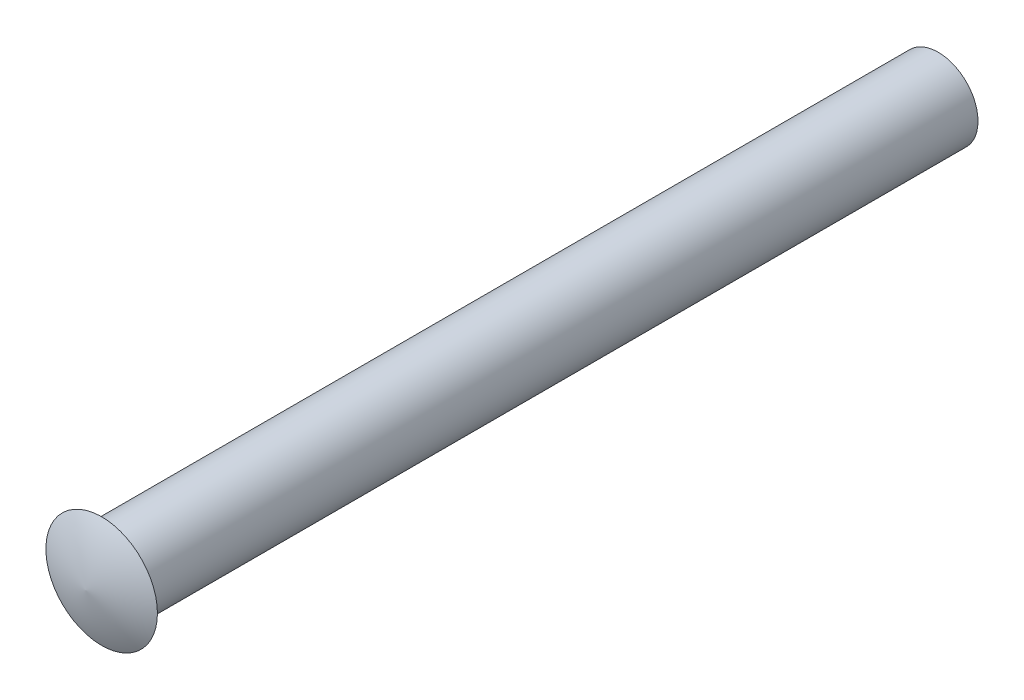
ISO-10303-21;
HEADER;
FILE_DESCRIPTION(('STEP AP214'),'2;1');
FILE_NAME('part.step','',(''),(''),'','','');
FILE_SCHEMA(('AUTOMOTIVE_DESIGN { 1 0 10303 214 1 1 1 1 }'));
ENDSEC;
DATA;
#1=APPLICATION_CONTEXT('core data for automotive mechanical design processes');
#2=APPLICATION_PROTOCOL_DEFINITION('international standard','automotive_design',2000,#1);
#3=PRODUCT_CONTEXT('',#1,'mechanical');
#4=PRODUCT('Part','Part','',(#3));
#5=PRODUCT_RELATED_PRODUCT_CATEGORY('part','',(#4));
#6=PRODUCT_DEFINITION_FORMATION('','',#4);
#7=PRODUCT_DEFINITION_CONTEXT('part definition',#1,'design');
#8=PRODUCT_DEFINITION('design','',#6,#7);
#9=PRODUCT_DEFINITION_SHAPE('','',#8);
#10=(LENGTH_UNIT() NAMED_UNIT(*) SI_UNIT(.MILLI.,.METRE.));
#11=(NAMED_UNIT(*) PLANE_ANGLE_UNIT() SI_UNIT($,.RADIAN.));
#12=(NAMED_UNIT(*) SI_UNIT($,.STERADIAN.) SOLID_ANGLE_UNIT());
#13=UNCERTAINTY_MEASURE_WITH_UNIT(LENGTH_MEASURE(1.E-05),#10,'distance_accuracy_value','');
#14=(GEOMETRIC_REPRESENTATION_CONTEXT(3) GLOBAL_UNCERTAINTY_ASSIGNED_CONTEXT((#13)) GLOBAL_UNIT_ASSIGNED_CONTEXT((#10,
#11,#12)) REPRESENTATION_CONTEXT('',''));
#15=CARTESIAN_POINT('',(0.,0.,0.));
#16=DIRECTION('',(0.,0.,1.));
#17=DIRECTION('',(1.,0.,0.));
#18=AXIS2_PLACEMENT_3D('',#15,#16,#17);
#19=CARTESIAN_POINT('',(-0.0951327416534469,0.,-0.995464595787062));
#20=DIRECTION('',(0.,-1.,0.));
#21=DIRECTION('',(1.,0.,0.));
#22=AXIS2_PLACEMENT_3D('',#19,#20,#21);
#23=CIRCLE('',#22,1.);
#24=TRIMMED_CURVE('',#23,(PARAMETER_VALUE(-1.47551950190482)),
(PARAMETER_VALUE(1.47551950190482)),.T.,.PARAMETER.);
#25=CARTESIAN_POINT('',(0.,0.,-0.995464595787062));
#26=DIRECTION('',(0.,0.,1.));
#27=AXIS1_PLACEMENT('',#25,#26);
#28=SURFACE_OF_REVOLUTION('',#24,#27);
#29=CARTESIAN_POINT('',(0.,0.,0.));
#30=VERTEX_POINT('',#29);
#31=VERTEX_LOOP('',#30);
#32=FACE_BOUND('',#31,.T.);
#33=CARTESIAN_POINT('',(0.,0.,-0.1));
#34=DIRECTION('',(0.,0.,1.));
#35=DIRECTION('',(1.,0.,0.));
#36=AXIS2_PLACEMENT_3D('',#33,#34,#35);
#37=CIRCLE('',#36,0.35);
#38=CARTESIAN_POINT('',(0.35,0.,-0.1));
#39=VERTEX_POINT('',#38);
#40=EDGE_CURVE('E11',#39,#39,#37,.T.);
#41=ORIENTED_EDGE('',*,*,#40,.T.);
#42=EDGE_LOOP('',(#41));
#43=FACE_BOUND('',#42,.T.);
#44=ADVANCED_FACE('F34',(#32,#43),#28,.T.);
#45=CARTESIAN_POINT('',(0.,0.35,-0.1));
#46=DIRECTION('',(0.,0.,1.));
#47=DIRECTION('',(1.,0.,0.));
#48=AXIS2_PLACEMENT_3D('',#45,#46,#47);
#49=PLANE('',#48);
#50=ORIENTED_EDGE('',*,*,#40,.F.);
#51=EDGE_LOOP('',(#50));
#52=FACE_BOUND('',#51,.T.);
#53=CARTESIAN_POINT('',(0.,0.,-0.1));
#54=DIRECTION('',(0.,0.,1.));
#55=DIRECTION('',(1.,0.,0.));
#56=AXIS2_PLACEMENT_3D('',#53,#54,#55);
#57=CIRCLE('',#56,0.25);
#58=CARTESIAN_POINT('',(0.25,0.,-0.1));
#59=VERTEX_POINT('',#58);
#60=EDGE_CURVE('E40',#59,#59,#57,.T.);
#61=ORIENTED_EDGE('',*,*,#60,.T.);
#62=EDGE_LOOP('',(#61));
#63=FACE_BOUND('',#62,.T.);
#64=ADVANCED_FACE('F45',(#52,#63),#49,.F.);
#65=CARTESIAN_POINT('',(0.,0.,0.));
#66=DIRECTION('',(0.,0.,1.));
#67=DIRECTION('',(1.,0.,0.));
#68=AXIS2_PLACEMENT_3D('',#65,#66,#67);
#69=CYLINDRICAL_SURFACE('',#68,0.25);
#70=ORIENTED_EDGE('',*,*,#60,.F.);
#71=EDGE_LOOP('',(#70));
#72=FACE_BOUND('',#71,.T.);
#73=CARTESIAN_POINT('',(0.,0.,-5.35));
#74=DIRECTION('',(0.,0.,1.));
#75=DIRECTION('',(1.,0.,0.));
#76=AXIS2_PLACEMENT_3D('',#73,#74,#75);
#77=CIRCLE('',#76,0.25);
#78=CARTESIAN_POINT('',(0.25,0.,-5.35));
#79=VERTEX_POINT('',#78);
#80=EDGE_CURVE('E54',#79,#79,#77,.T.);
#81=ORIENTED_EDGE('',*,*,#80,.T.);
#82=EDGE_LOOP('',(#81));
#83=FACE_BOUND('',#82,.T.);
#84=ADVANCED_FACE('F50',(#72,#83),#69,.T.);
#85=CARTESIAN_POINT('',(0.,0.25,-5.35));
#86=DIRECTION('',(0.,0.,1.));
#87=DIRECTION('',(1.,0.,0.));
#88=AXIS2_PLACEMENT_3D('',#85,#86,#87);
#89=PLANE('',#88);
#90=ORIENTED_EDGE('',*,*,#80,.F.);
#91=EDGE_LOOP('',(#90));
#92=FACE_BOUND('',#91,.T.);
#93=ADVANCED_FACE('F60',(#92),#89,.F.);
#94=CLOSED_SHELL('',(#44,#64,#84,#93));
#95=MANIFOLD_SOLID_BREP('B2',#94);
#96=ADVANCED_BREP_SHAPE_REPRESENTATION('',(#18,#95),#14);
#97=SHAPE_DEFINITION_REPRESENTATION(#9,#96);
ENDSEC;
END-ISO-10303-21;
